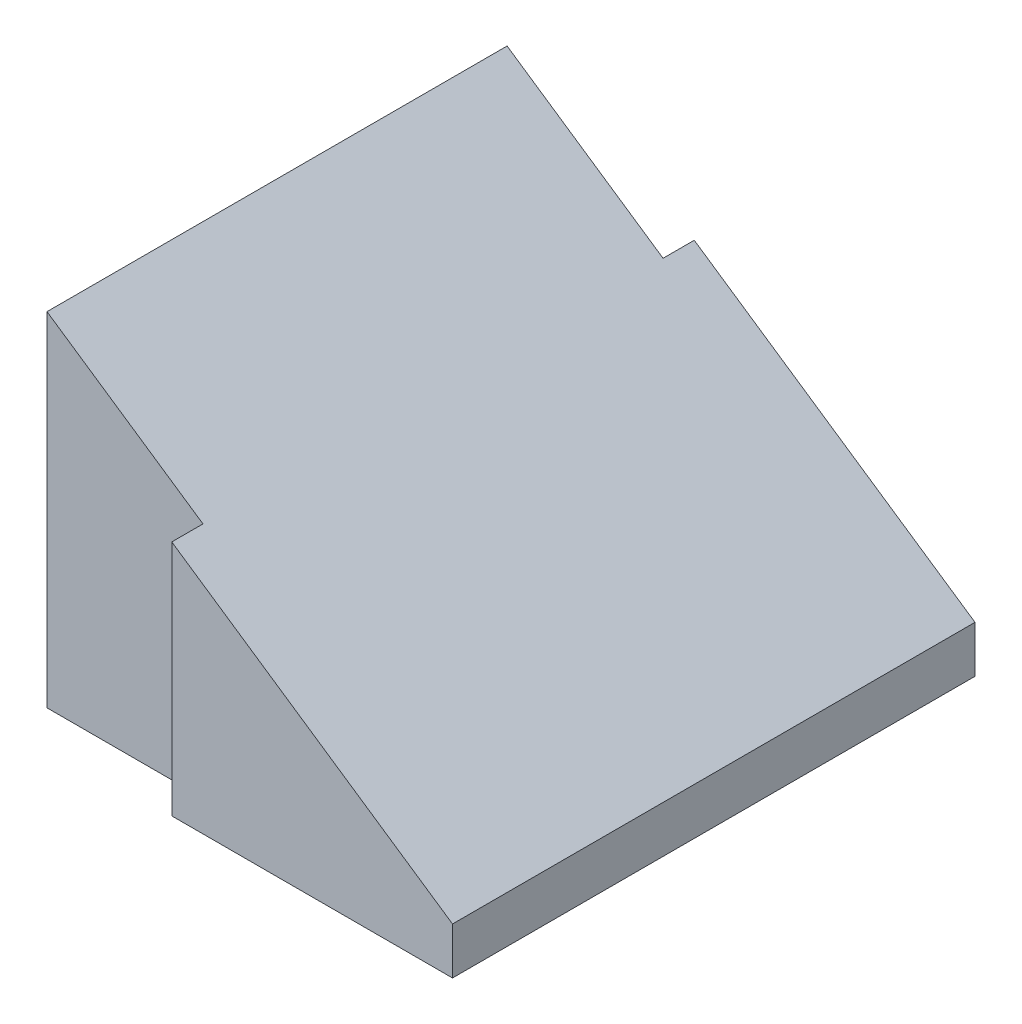
ISO-10303-21;
HEADER;
FILE_DESCRIPTION(('STEP AP214'),'2;1');
FILE_NAME('part.step','',(''),(''),'','','');
FILE_SCHEMA(('AUTOMOTIVE_DESIGN { 1 0 10303 214 1 1 1 1 }'));
ENDSEC;
DATA;
#1=APPLICATION_CONTEXT('core data for automotive mechanical design processes');
#2=APPLICATION_PROTOCOL_DEFINITION('international standard','automotive_design',2000,#1);
#3=PRODUCT_CONTEXT('',#1,'mechanical');
#4=PRODUCT('Part','Part','',(#3));
#5=PRODUCT_RELATED_PRODUCT_CATEGORY('part','',(#4));
#6=PRODUCT_DEFINITION_FORMATION('','',#4);
#7=PRODUCT_DEFINITION_CONTEXT('part definition',#1,'design');
#8=PRODUCT_DEFINITION('design','',#6,#7);
#9=PRODUCT_DEFINITION_SHAPE('','',#8);
#10=(LENGTH_UNIT() NAMED_UNIT(*) SI_UNIT(.MILLI.,.METRE.));
#11=(NAMED_UNIT(*) PLANE_ANGLE_UNIT() SI_UNIT($,.RADIAN.));
#12=(NAMED_UNIT(*) SI_UNIT($,.STERADIAN.) SOLID_ANGLE_UNIT());
#13=UNCERTAINTY_MEASURE_WITH_UNIT(LENGTH_MEASURE(1.E-05),#10,'distance_accuracy_value','');
#14=(GEOMETRIC_REPRESENTATION_CONTEXT(3) GLOBAL_UNCERTAINTY_ASSIGNED_CONTEXT((#13)) GLOBAL_UNIT_ASSIGNED_CONTEXT((#10,
#11,#12)) REPRESENTATION_CONTEXT('',''));
#15=CARTESIAN_POINT('',(0.,0.,0.));
#16=DIRECTION('',(0.,0.,1.));
#17=DIRECTION('',(1.,0.,0.));
#18=AXIS2_PLACEMENT_3D('',#15,#16,#17);
#19=CARTESIAN_POINT('',(-14.,22.,16.75));
#20=DIRECTION('',(1.,0.,0.));
#21=DIRECTION('',(0.,0.,-1.));
#22=AXIS2_PLACEMENT_3D('',#19,#20,#21);
#23=PLANE('',#22);
#24=DIRECTION('',(0.,0.,1.));
#25=VECTOR('',#24,1.);
#26=CARTESIAN_POINT('',(-14.,0.,16.75));
#27=LINE('',#26,#25);
#28=CARTESIAN_POINT('',(-14.,0.,-14.75));
#29=VERTEX_POINT('',#28);
#30=CARTESIAN_POINT('',(-14.,0.,14.75));
#31=VERTEX_POINT('',#30);
#32=EDGE_CURVE('E130',#29,#31,#27,.T.);
#33=ORIENTED_EDGE('',*,*,#32,.T.);
#34=DIRECTION('',(0.,-1.,0.));
#35=VECTOR('',#34,1.);
#36=CARTESIAN_POINT('',(-14.,49.,14.75));
#37=LINE('',#36,#35);
#38=CARTESIAN_POINT('',(-14.,22.,14.75));
#39=VERTEX_POINT('',#38);
#40=EDGE_CURVE('E122',#39,#31,#37,.T.);
#41=ORIENTED_EDGE('',*,*,#40,.F.);
#42=DIRECTION('',(0.,0.,1.));
#43=VECTOR('',#42,1.);
#44=CARTESIAN_POINT('',(-14.,22.,16.75));
#45=LINE('',#44,#43);
#46=CARTESIAN_POINT('',(-14.,22.,-14.75));
#47=VERTEX_POINT('',#46);
#48=EDGE_CURVE('E144',#47,#39,#45,.T.);
#49=ORIENTED_EDGE('',*,*,#48,.F.);
#50=DIRECTION('',(0.,-1.,0.));
#51=VECTOR('',#50,1.);
#52=CARTESIAN_POINT('',(-14.,49.,-14.75));
#53=LINE('',#52,#51);
#54=EDGE_CURVE('E61',#47,#29,#53,.T.);
#55=ORIENTED_EDGE('',*,*,#54,.T.);
#56=EDGE_LOOP('',(#33,#41,#49,#55));
#57=FACE_BOUND('',#56,.T.);
#58=ADVANCED_FACE('F39',(#57),#23,.F.);
#59=CARTESIAN_POINT('',(14.,22.,16.75));
#60=DIRECTION('',(0.,0.,-1.));
#61=DIRECTION('',(-1.,0.,0.));
#62=AXIS2_PLACEMENT_3D('',#59,#60,#61);
#63=PLANE('',#62);
#64=DIRECTION('',(0.,-1.,0.));
#65=VECTOR('',#64,1.);
#66=CARTESIAN_POINT('',(-3.99999999999999,49.,16.75));
#67=LINE('',#66,#65);
#68=CARTESIAN_POINT('',(-3.99999999999999,15.2142857142857,16.75));
#69=VERTEX_POINT('',#68);
#70=CARTESIAN_POINT('',(-3.99999999999999,0.,16.75));
#71=VERTEX_POINT('',#70);
#72=EDGE_CURVE('E105',#69,#71,#67,.T.);
#73=ORIENTED_EDGE('',*,*,#72,.T.);
#74=DIRECTION('',(1.,0.,0.));
#75=VECTOR('',#74,1.);
#76=CARTESIAN_POINT('',(14.,0.,16.75));
#77=LINE('',#76,#75);
#78=CARTESIAN_POINT('',(14.,0.,16.75));
#79=VERTEX_POINT('',#78);
#80=EDGE_CURVE('E118',#71,#79,#77,.T.);
#81=ORIENTED_EDGE('',*,*,#80,.T.);
#82=DIRECTION('',(0.,-1.,0.));
#83=VECTOR('',#82,1.);
#84=CARTESIAN_POINT('',(14.,22.,16.75));
#85=LINE('',#84,#83);
#86=CARTESIAN_POINT('',(14.,3.,16.75));
#87=VERTEX_POINT('',#86);
#88=EDGE_CURVE('E148',#87,#79,#85,.T.);
#89=ORIENTED_EDGE('',*,*,#88,.F.);
#90=DIRECTION('',(0.827475774391758,-0.561501418337265,0.));
#91=VECTOR('',#90,1.);
#92=CARTESIAN_POINT('',(5.80786026200874,8.55895196506551,16.75));
#93=LINE('',#92,#91);
#94=EDGE_CURVE('E120',#69,#87,#93,.T.);
#95=ORIENTED_EDGE('',*,*,#94,.F.);
#96=EDGE_LOOP('',(#73,#81,#89,#95));
#97=FACE_BOUND('',#96,.T.);
#98=ADVANCED_FACE('F116',(#97),#63,.F.);
#99=CARTESIAN_POINT('',(14.,22.,-16.75));
#100=DIRECTION('',(0.,0.,1.));
#101=DIRECTION('',(1.,0.,0.));
#102=AXIS2_PLACEMENT_3D('',#99,#100,#101);
#103=PLANE('',#102);
#104=DIRECTION('',(0.,-1.,0.));
#105=VECTOR('',#104,1.);
#106=CARTESIAN_POINT('',(-3.99999999999999,49.,-16.75));
#107=LINE('',#106,#105);
#108=CARTESIAN_POINT('',(-3.99999999999999,15.2142857142857,-16.75));
#109=VERTEX_POINT('',#108);
#110=CARTESIAN_POINT('',(-3.99999999999999,0.,-16.75));
#111=VERTEX_POINT('',#110);
#112=EDGE_CURVE('E112',#109,#111,#107,.T.);
#113=ORIENTED_EDGE('',*,*,#112,.F.);
#114=DIRECTION('',(0.827475774391758,-0.561501418337265,0.));
#115=VECTOR('',#114,1.);
#116=CARTESIAN_POINT('',(5.17205240174673,8.99039301310044,-16.75));
#117=LINE('',#116,#115);
#118=CARTESIAN_POINT('',(14.,3.,-16.75));
#119=VERTEX_POINT('',#118);
#120=EDGE_CURVE('E137',#109,#119,#117,.T.);
#121=ORIENTED_EDGE('',*,*,#120,.T.);
#122=DIRECTION('',(0.,-1.,0.));
#123=VECTOR('',#122,1.);
#124=CARTESIAN_POINT('',(14.,22.,-16.75));
#125=LINE('',#124,#123);
#126=CARTESIAN_POINT('',(14.,0.,-16.75));
#127=VERTEX_POINT('',#126);
#128=EDGE_CURVE('E145',#119,#127,#125,.T.);
#129=ORIENTED_EDGE('',*,*,#128,.T.);
#130=DIRECTION('',(-1.,0.,0.));
#131=VECTOR('',#130,1.);
#132=CARTESIAN_POINT('',(14.,0.,-16.75));
#133=LINE('',#132,#131);
#134=EDGE_CURVE('E134',#127,#111,#133,.T.);
#135=ORIENTED_EDGE('',*,*,#134,.T.);
#136=EDGE_LOOP('',(#113,#121,#129,#135));
#137=FACE_BOUND('',#136,.T.);
#138=ADVANCED_FACE('F199',(#137),#103,.F.);
#139=CARTESIAN_POINT('',(0.,0.,0.));
#140=DIRECTION('',(0.,1.,0.));
#141=DIRECTION('',(0.,0.,1.));
#142=AXIS2_PLACEMENT_3D('',#139,#140,#141);
#143=PLANE('',#142);
#144=DIRECTION('',(0.,0.,-1.));
#145=VECTOR('',#144,1.);
#146=CARTESIAN_POINT('',(-3.99999999999999,0.,0.));
#147=LINE('',#146,#145);
#148=CARTESIAN_POINT('',(-3.99999999999999,0.,14.75));
#149=VERTEX_POINT('',#148);
#150=EDGE_CURVE('E102',#71,#149,#147,.T.);
#151=ORIENTED_EDGE('',*,*,#150,.T.);
#152=DIRECTION('',(1.,0.,0.));
#153=VECTOR('',#152,1.);
#154=CARTESIAN_POINT('',(0.,0.,14.75));
#155=LINE('',#154,#153);
#156=EDGE_CURVE('E111',#31,#149,#155,.T.);
#157=ORIENTED_EDGE('',*,*,#156,.F.);
#158=ORIENTED_EDGE('',*,*,#32,.F.);
#159=DIRECTION('',(1.,0.,0.));
#160=VECTOR('',#159,1.);
#161=CARTESIAN_POINT('',(0.,0.,-14.75));
#162=LINE('',#161,#160);
#163=CARTESIAN_POINT('',(-3.99999999999999,0.,-14.75));
#164=VERTEX_POINT('',#163);
#165=EDGE_CURVE('E176',#29,#164,#162,.T.);
#166=ORIENTED_EDGE('',*,*,#165,.T.);
#167=DIRECTION('',(0.,0.,-1.));
#168=VECTOR('',#167,1.);
#169=CARTESIAN_POINT('',(-3.99999999999999,0.,0.));
#170=LINE('',#169,#168);
#171=EDGE_CURVE('E172',#164,#111,#170,.T.);
#172=ORIENTED_EDGE('',*,*,#171,.T.);
#173=ORIENTED_EDGE('',*,*,#134,.F.);
#174=DIRECTION('',(0.,0.,-1.));
#175=VECTOR('',#174,1.);
#176=CARTESIAN_POINT('',(14.,0.,16.75));
#177=LINE('',#176,#175);
#178=EDGE_CURVE('E128',#79,#127,#177,.T.);
#179=ORIENTED_EDGE('',*,*,#178,.F.);
#180=ORIENTED_EDGE('',*,*,#80,.F.);
#181=EDGE_LOOP('',(#151,#157,#158,#166,#172,#173,#179,#180));
#182=FACE_BOUND('',#181,.T.);
#183=ADVANCED_FACE('F125',(#182),#143,.F.);
#184=CARTESIAN_POINT('',(5.80786026200874,8.55895196506551,-27.25));
#185=DIRECTION('',(-0.561501418337265,-0.827475774391759,0.));
#186=DIRECTION('',(0.827475774391758,-0.561501418337265,0.));
#187=AXIS2_PLACEMENT_3D('',#184,#185,#186);
#188=PLANE('',#187);
#189=DIRECTION('',(0.,0.,-1.));
#190=VECTOR('',#189,1.);
#191=CARTESIAN_POINT('',(-3.99999999999999,15.2142857142857,-27.25));
#192=LINE('',#191,#190);
#193=CARTESIAN_POINT('',(-3.99999999999999,15.2142857142857,14.75));
#194=VERTEX_POINT('',#193);
#195=EDGE_CURVE('E11',#69,#194,#192,.T.);
#196=ORIENTED_EDGE('',*,*,#195,.F.);
#197=ORIENTED_EDGE('',*,*,#94,.T.);
#198=DIRECTION('',(0.,0.,1.));
#199=VECTOR('',#198,1.);
#200=CARTESIAN_POINT('',(14.,3.,-27.25));
#201=LINE('',#200,#199);
#202=EDGE_CURVE('E189',#119,#87,#201,.T.);
#203=ORIENTED_EDGE('',*,*,#202,.F.);
#204=ORIENTED_EDGE('',*,*,#120,.F.);
#205=DIRECTION('',(0.,0.,-1.));
#206=VECTOR('',#205,1.);
#207=CARTESIAN_POINT('',(-3.99999999999999,15.2142857142857,-27.25));
#208=LINE('',#207,#206);
#209=CARTESIAN_POINT('',(-3.99999999999999,15.2142857142857,-14.75));
#210=VERTEX_POINT('',#209);
#211=EDGE_CURVE('E154',#210,#109,#208,.T.);
#212=ORIENTED_EDGE('',*,*,#211,.F.);
#213=DIRECTION('',(0.827475774391758,-0.561501418337265,0.));
#214=VECTOR('',#213,1.);
#215=CARTESIAN_POINT('',(5.80786026200874,8.55895196506551,-14.75));
#216=LINE('',#215,#214);
#217=EDGE_CURVE('E151',#47,#210,#216,.T.);
#218=ORIENTED_EDGE('',*,*,#217,.F.);
#219=ORIENTED_EDGE('',*,*,#48,.T.);
#220=DIRECTION('',(0.827475774391758,-0.561501418337265,0.));
#221=VECTOR('',#220,1.);
#222=CARTESIAN_POINT('',(5.80786026200874,8.55895196506551,14.75));
#223=LINE('',#222,#221);
#224=EDGE_CURVE('E47',#39,#194,#223,.T.);
#225=ORIENTED_EDGE('',*,*,#224,.T.);
#226=EDGE_LOOP('',(#196,#197,#203,#204,#212,#218,#219,#225));
#227=FACE_BOUND('',#226,.T.);
#228=ADVANCED_FACE('F160',(#227),#188,.F.);
#229=CARTESIAN_POINT('',(14.,22.,16.75));
#230=DIRECTION('',(-1.,0.,0.));
#231=DIRECTION('',(0.,0.,1.));
#232=AXIS2_PLACEMENT_3D('',#229,#230,#231);
#233=PLANE('',#232);
#234=ORIENTED_EDGE('',*,*,#128,.F.);
#235=ORIENTED_EDGE('',*,*,#202,.T.);
#236=ORIENTED_EDGE('',*,*,#88,.T.);
#237=ORIENTED_EDGE('',*,*,#178,.T.);
#238=EDGE_LOOP('',(#234,#235,#236,#237));
#239=FACE_BOUND('',#238,.T.);
#240=ADVANCED_FACE('F203',(#239),#233,.F.);
#241=CARTESIAN_POINT('',(-3.99999999999999,49.,0.));
#242=DIRECTION('',(-1.,0.,0.));
#243=DIRECTION('',(0.,0.,1.));
#244=AXIS2_PLACEMENT_3D('',#241,#242,#243);
#245=PLANE('',#244);
#246=ORIENTED_EDGE('',*,*,#211,.T.);
#247=ORIENTED_EDGE('',*,*,#112,.T.);
#248=ORIENTED_EDGE('',*,*,#171,.F.);
#249=DIRECTION('',(0.,-1.,0.));
#250=VECTOR('',#249,1.);
#251=CARTESIAN_POINT('',(-3.99999999999999,49.,-14.75));
#252=LINE('',#251,#250);
#253=EDGE_CURVE('E180',#210,#164,#252,.T.);
#254=ORIENTED_EDGE('',*,*,#253,.F.);
#255=EDGE_LOOP('',(#246,#247,#248,#254));
#256=FACE_BOUND('',#255,.T.);
#257=ADVANCED_FACE('F207',(#256),#245,.T.);
#258=CARTESIAN_POINT('',(0.,49.,-14.75));
#259=DIRECTION('',(0.,0.,-1.));
#260=DIRECTION('',(-1.,0.,0.));
#261=AXIS2_PLACEMENT_3D('',#258,#259,#260);
#262=PLANE('',#261);
#263=ORIENTED_EDGE('',*,*,#217,.T.);
#264=ORIENTED_EDGE('',*,*,#253,.T.);
#265=ORIENTED_EDGE('',*,*,#165,.F.);
#266=ORIENTED_EDGE('',*,*,#54,.F.);
#267=EDGE_LOOP('',(#263,#264,#265,#266));
#268=FACE_BOUND('',#267,.T.);
#269=ADVANCED_FACE('F208',(#268),#262,.T.);
#270=CARTESIAN_POINT('',(-3.99999999999999,49.,0.));
#271=DIRECTION('',(-1.,0.,0.));
#272=DIRECTION('',(0.,0.,1.));
#273=AXIS2_PLACEMENT_3D('',#270,#271,#272);
#274=PLANE('',#273);
#275=ORIENTED_EDGE('',*,*,#195,.T.);
#276=DIRECTION('',(0.,-1.,0.));
#277=VECTOR('',#276,1.);
#278=CARTESIAN_POINT('',(-3.99999999999999,49.,14.75));
#279=LINE('',#278,#277);
#280=EDGE_CURVE('E54',#194,#149,#279,.T.);
#281=ORIENTED_EDGE('',*,*,#280,.T.);
#282=ORIENTED_EDGE('',*,*,#150,.F.);
#283=ORIENTED_EDGE('',*,*,#72,.F.);
#284=EDGE_LOOP('',(#275,#281,#282,#283));
#285=FACE_BOUND('',#284,.T.);
#286=ADVANCED_FACE('F104',(#285),#274,.T.);
#287=CARTESIAN_POINT('',(0.,49.,14.75));
#288=DIRECTION('',(0.,0.,-1.));
#289=DIRECTION('',(-1.,0.,0.));
#290=AXIS2_PLACEMENT_3D('',#287,#288,#289);
#291=PLANE('',#290);
#292=ORIENTED_EDGE('',*,*,#40,.T.);
#293=ORIENTED_EDGE('',*,*,#156,.T.);
#294=ORIENTED_EDGE('',*,*,#280,.F.);
#295=ORIENTED_EDGE('',*,*,#224,.F.);
#296=EDGE_LOOP('',(#292,#293,#294,#295));
#297=FACE_BOUND('',#296,.T.);
#298=ADVANCED_FACE('F163',(#297),#291,.F.);
#299=CLOSED_SHELL('',(#58,#98,#138,#183,#228,#240,#257,#269,#286,#298));
#300=MANIFOLD_SOLID_BREP('B2',#299);
#301=ADVANCED_BREP_SHAPE_REPRESENTATION('',(#18,#300),#14);
#302=SHAPE_DEFINITION_REPRESENTATION(#9,#301);
ENDSEC;
END-ISO-10303-21;
